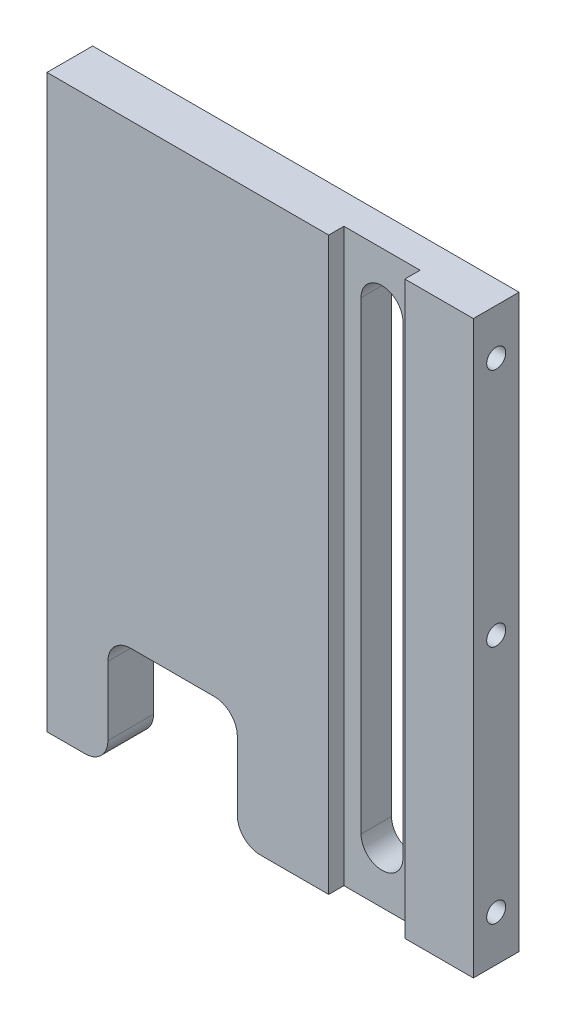
ISO-10303-21;
HEADER;
FILE_DESCRIPTION(('STEP AP214'),'2;1');
FILE_NAME('part.step','',(''),(''),'','','');
FILE_SCHEMA(('AUTOMOTIVE_DESIGN { 1 0 10303 214 1 1 1 1 }'));
ENDSEC;
DATA;
#1=APPLICATION_CONTEXT('core data for automotive mechanical design processes');
#2=APPLICATION_PROTOCOL_DEFINITION('international standard','automotive_design',2000,#1);
#3=PRODUCT_CONTEXT('',#1,'mechanical');
#4=PRODUCT('Part','Part','',(#3));
#5=PRODUCT_RELATED_PRODUCT_CATEGORY('part','',(#4));
#6=PRODUCT_DEFINITION_FORMATION('','',#4);
#7=PRODUCT_DEFINITION_CONTEXT('part definition',#1,'design');
#8=PRODUCT_DEFINITION('design','',#6,#7);
#9=PRODUCT_DEFINITION_SHAPE('','',#8);
#10=(LENGTH_UNIT() NAMED_UNIT(*) SI_UNIT(.MILLI.,.METRE.));
#11=(NAMED_UNIT(*) PLANE_ANGLE_UNIT() SI_UNIT($,.RADIAN.));
#12=(NAMED_UNIT(*) SI_UNIT($,.STERADIAN.) SOLID_ANGLE_UNIT());
#13=UNCERTAINTY_MEASURE_WITH_UNIT(LENGTH_MEASURE(1.E-05),#10,'distance_accuracy_value','');
#14=(GEOMETRIC_REPRESENTATION_CONTEXT(3) GLOBAL_UNCERTAINTY_ASSIGNED_CONTEXT((#13)) GLOBAL_UNIT_ASSIGNED_CONTEXT((#10,
#11,#12)) REPRESENTATION_CONTEXT('',''));
#15=CARTESIAN_POINT('',(0.,0.,0.));
#16=DIRECTION('',(0.,0.,1.));
#17=DIRECTION('',(1.,0.,0.));
#18=AXIS2_PLACEMENT_3D('',#15,#16,#17);
#19=CARTESIAN_POINT('',(-28.,-37.5,6.));
#20=DIRECTION('',(0.,1.,0.));
#21=DIRECTION('',(0.,0.,1.));
#22=AXIS2_PLACEMENT_3D('',#19,#20,#21);
#23=PLANE('',#22);
#24=DIRECTION('',(1.,0.,0.));
#25=VECTOR('',#24,1.);
#26=CARTESIAN_POINT('',(-28.,-37.5,6.));
#27=LINE('',#26,#25);
#28=CARTESIAN_POINT('',(0.,-37.5,6.));
#29=VERTEX_POINT('',#28);
#30=CARTESIAN_POINT('',(9.00000000000001,-37.5,6.));
#31=VERTEX_POINT('',#30);
#32=EDGE_CURVE('E318',#29,#31,#27,.T.);
#33=ORIENTED_EDGE('',*,*,#32,.F.);
#34=DIRECTION('',(0.,0.,1.));
#35=VECTOR('',#34,1.);
#36=CARTESIAN_POINT('',(0.,-37.5,6.));
#37=LINE('',#36,#35);
#38=CARTESIAN_POINT('',(0.,-37.5,0.));
#39=VERTEX_POINT('',#38);
#40=EDGE_CURVE('E363',#29,#39,#37,.F.);
#41=ORIENTED_EDGE('',*,*,#40,.T.);
#42=DIRECTION('',(1.,0.,0.));
#43=VECTOR('',#42,1.);
#44=CARTESIAN_POINT('',(-28.,-37.5,0.));
#45=LINE('',#44,#43);
#46=CARTESIAN_POINT('',(28.,-37.5,0.));
#47=VERTEX_POINT('',#46);
#48=EDGE_CURVE('E325',#39,#47,#45,.T.);
#49=ORIENTED_EDGE('',*,*,#48,.T.);
#50=DIRECTION('',(0.,0.,-1.));
#51=VECTOR('',#50,1.);
#52=CARTESIAN_POINT('',(28.,-37.5,6.));
#53=LINE('',#52,#51);
#54=CARTESIAN_POINT('',(28.,-37.5,6.));
#55=VERTEX_POINT('',#54);
#56=EDGE_CURVE('E317',#55,#47,#53,.T.);
#57=ORIENTED_EDGE('',*,*,#56,.F.);
#58=CARTESIAN_POINT('',(19.,-37.5,6.));
#59=VERTEX_POINT('',#58);
#60=EDGE_CURVE('E313',#59,#55,#27,.T.);
#61=ORIENTED_EDGE('',*,*,#60,.F.);
#62=DIRECTION('',(0.,0.,1.));
#63=VECTOR('',#62,1.);
#64=CARTESIAN_POINT('',(19.,-37.5,4.));
#65=LINE('',#64,#63);
#66=CARTESIAN_POINT('',(19.,-37.5,4.));
#67=VERTEX_POINT('',#66);
#68=EDGE_CURVE('E203',#67,#59,#65,.T.);
#69=ORIENTED_EDGE('',*,*,#68,.F.);
#70=DIRECTION('',(1.,0.,0.));
#71=VECTOR('',#70,1.);
#72=CARTESIAN_POINT('',(19.,-37.5,4.));
#73=LINE('',#72,#71);
#74=CARTESIAN_POINT('',(9.00000000000001,-37.5,4.));
#75=VERTEX_POINT('',#74);
#76=EDGE_CURVE('E211',#75,#67,#73,.T.);
#77=ORIENTED_EDGE('',*,*,#76,.F.);
#78=DIRECTION('',(0.,0.,1.));
#79=VECTOR('',#78,1.);
#80=CARTESIAN_POINT('',(9.00000000000001,-37.5,4.));
#81=LINE('',#80,#79);
#82=EDGE_CURVE('E193',#75,#31,#81,.T.);
#83=ORIENTED_EDGE('',*,*,#82,.T.);
#84=EDGE_LOOP('',(#33,#41,#49,#57,#61,#69,#77,#83));
#85=FACE_BOUND('',#84,.T.);
#86=ADVANCED_FACE('F37',(#85),#23,.F.);
#87=CARTESIAN_POINT('',(0.,0.,6.));
#88=DIRECTION('',(0.,0.,1.));
#89=DIRECTION('',(1.,0.,0.));
#90=AXIS2_PLACEMENT_3D('',#87,#88,#89);
#91=PLANE('',#90);
#92=CARTESIAN_POINT('',(-28.,-37.5,6.));
#93=VERTEX_POINT('',#92);
#94=CARTESIAN_POINT('',(-23.,-37.5,6.));
#95=VERTEX_POINT('',#94);
#96=EDGE_CURVE('E314',#93,#95,#27,.T.);
#97=ORIENTED_EDGE('',*,*,#96,.T.);
#98=CARTESIAN_POINT('',(-23.,-34.5,6.));
#99=DIRECTION('',(0.,0.,1.));
#100=DIRECTION('',(1.,0.,0.));
#101=AXIS2_PLACEMENT_3D('',#98,#99,#100);
#102=CIRCLE('',#101,3.);
#103=CARTESIAN_POINT('',(-20.,-34.5,6.));
#104=VERTEX_POINT('',#103);
#105=EDGE_CURVE('E347',#95,#104,#102,.T.);
#106=ORIENTED_EDGE('',*,*,#105,.T.);
#107=DIRECTION('',(0.,-1.,0.));
#108=VECTOR('',#107,1.);
#109=CARTESIAN_POINT('',(-20.,-22.5,6.));
#110=LINE('',#109,#108);
#111=CARTESIAN_POINT('',(-20.,-25.5,6.));
#112=VERTEX_POINT('',#111);
#113=EDGE_CURVE('E377',#112,#104,#110,.T.);
#114=ORIENTED_EDGE('',*,*,#113,.F.);
#115=CARTESIAN_POINT('',(-17.,-25.5,6.));
#116=DIRECTION('',(0.,0.,1.));
#117=DIRECTION('',(1.,0.,0.));
#118=AXIS2_PLACEMENT_3D('',#115,#116,#117);
#119=CIRCLE('',#118,3.);
#120=CARTESIAN_POINT('',(-17.,-22.5,6.));
#121=VERTEX_POINT('',#120);
#122=EDGE_CURVE('E45',#112,#121,#119,.F.);
#123=ORIENTED_EDGE('',*,*,#122,.T.);
#124=DIRECTION('',(-1.,0.,0.));
#125=VECTOR('',#124,1.);
#126=CARTESIAN_POINT('',(-20.,-22.5,6.));
#127=LINE('',#126,#125);
#128=CARTESIAN_POINT('',(-6.,-22.5,6.));
#129=VERTEX_POINT('',#128);
#130=EDGE_CURVE('E375',#129,#121,#127,.T.);
#131=ORIENTED_EDGE('',*,*,#130,.F.);
#132=CARTESIAN_POINT('',(-6.,-25.5,6.));
#133=DIRECTION('',(0.,0.,1.));
#134=DIRECTION('',(1.,0.,0.));
#135=AXIS2_PLACEMENT_3D('',#132,#133,#134);
#136=CIRCLE('',#135,3.);
#137=CARTESIAN_POINT('',(-3.,-25.5,6.));
#138=VERTEX_POINT('',#137);
#139=EDGE_CURVE('E369',#129,#138,#136,.F.);
#140=ORIENTED_EDGE('',*,*,#139,.T.);
#141=DIRECTION('',(0.,1.,0.));
#142=VECTOR('',#141,1.);
#143=CARTESIAN_POINT('',(-3.,-22.5,6.));
#144=LINE('',#143,#142);
#145=CARTESIAN_POINT('',(-3.,-34.5,6.));
#146=VERTEX_POINT('',#145);
#147=EDGE_CURVE('E382',#146,#138,#144,.T.);
#148=ORIENTED_EDGE('',*,*,#147,.F.);
#149=CARTESIAN_POINT('',(0.,-34.5,6.));
#150=DIRECTION('',(0.,0.,1.));
#151=DIRECTION('',(1.,0.,0.));
#152=AXIS2_PLACEMENT_3D('',#149,#150,#151);
#153=CIRCLE('',#152,3.);
#154=EDGE_CURVE('E345',#146,#29,#153,.T.);
#155=ORIENTED_EDGE('',*,*,#154,.T.);
#156=ORIENTED_EDGE('',*,*,#32,.T.);
#157=DIRECTION('',(0.,-1.,0.));
#158=VECTOR('',#157,1.);
#159=CARTESIAN_POINT('',(9.00000000000001,37.5,6.));
#160=LINE('',#159,#158);
#161=CARTESIAN_POINT('',(9.00000000000001,37.5,6.));
#162=VERTEX_POINT('',#161);
#163=EDGE_CURVE('E199',#162,#31,#160,.T.);
#164=ORIENTED_EDGE('',*,*,#163,.F.);
#165=DIRECTION('',(-1.,0.,0.));
#166=VECTOR('',#165,1.);
#167=CARTESIAN_POINT('',(-28.,37.5,6.));
#168=LINE('',#167,#166);
#169=CARTESIAN_POINT('',(-28.,37.5,6.));
#170=VERTEX_POINT('',#169);
#171=EDGE_CURVE('E306',#162,#170,#168,.T.);
#172=ORIENTED_EDGE('',*,*,#171,.T.);
#173=DIRECTION('',(0.,-1.,0.));
#174=VECTOR('',#173,1.);
#175=CARTESIAN_POINT('',(-28.,37.5,6.));
#176=LINE('',#175,#174);
#177=EDGE_CURVE('E311',#170,#93,#176,.T.);
#178=ORIENTED_EDGE('',*,*,#177,.T.);
#179=EDGE_LOOP('',(#97,#106,#114,#123,#131,#140,#148,#155,#156,#164,#172,#178));
#180=FACE_BOUND('',#179,.T.);
#181=ADVANCED_FACE('F374',(#180),#91,.T.);
#182=CARTESIAN_POINT('',(28.,37.5,6.));
#183=DIRECTION('',(-1.,0.,0.));
#184=DIRECTION('',(0.,0.,1.));
#185=AXIS2_PLACEMENT_3D('',#182,#183,#184);
#186=PLANE('',#185);
#187=CARTESIAN_POINT('',(28.,31.5,2.99999999999999));
#188=DIRECTION('',(1.,0.,0.));
#189=DIRECTION('',(0.,0.,-1.));
#190=AXIS2_PLACEMENT_3D('',#187,#188,#189);
#191=CIRCLE('',#190,1.25);
#192=CARTESIAN_POINT('',(28.,31.5,1.74999999999999));
#193=VERTEX_POINT('',#192);
#194=EDGE_CURVE('E242',#193,#193,#191,.T.);
#195=ORIENTED_EDGE('',*,*,#194,.F.);
#196=EDGE_LOOP('',(#195));
#197=FACE_BOUND('',#196,.T.);
#198=CARTESIAN_POINT('',(28.,0.,3.));
#199=DIRECTION('',(1.,0.,0.));
#200=DIRECTION('',(0.,0.,-1.));
#201=AXIS2_PLACEMENT_3D('',#198,#199,#200);
#202=CIRCLE('',#201,1.25);
#203=CARTESIAN_POINT('',(28.,0.,1.75));
#204=VERTEX_POINT('',#203);
#205=EDGE_CURVE('E248',#204,#204,#202,.T.);
#206=ORIENTED_EDGE('',*,*,#205,.F.);
#207=EDGE_LOOP('',(#206));
#208=FACE_BOUND('',#207,.T.);
#209=CARTESIAN_POINT('',(28.,-31.5,3.));
#210=DIRECTION('',(1.,0.,0.));
#211=DIRECTION('',(0.,0.,-1.));
#212=AXIS2_PLACEMENT_3D('',#209,#210,#211);
#213=CIRCLE('',#212,1.25);
#214=CARTESIAN_POINT('',(28.,-31.5,1.75));
#215=VERTEX_POINT('',#214);
#216=EDGE_CURVE('E254',#215,#215,#213,.T.);
#217=ORIENTED_EDGE('',*,*,#216,.F.);
#218=EDGE_LOOP('',(#217));
#219=FACE_BOUND('',#218,.T.);
#220=DIRECTION('',(0.,1.,0.));
#221=VECTOR('',#220,1.);
#222=CARTESIAN_POINT('',(28.,37.5,0.));
#223=LINE('',#222,#221);
#224=CARTESIAN_POINT('',(28.,37.5,0.));
#225=VERTEX_POINT('',#224);
#226=EDGE_CURVE('E294',#47,#225,#223,.T.);
#227=ORIENTED_EDGE('',*,*,#226,.T.);
#228=DIRECTION('',(0.,0.,-1.));
#229=VECTOR('',#228,1.);
#230=CARTESIAN_POINT('',(28.,37.5,6.));
#231=LINE('',#230,#229);
#232=CARTESIAN_POINT('',(28.,37.5,6.));
#233=VERTEX_POINT('',#232);
#234=EDGE_CURVE('E336',#233,#225,#231,.T.);
#235=ORIENTED_EDGE('',*,*,#234,.F.);
#236=DIRECTION('',(0.,1.,0.));
#237=VECTOR('',#236,1.);
#238=CARTESIAN_POINT('',(28.,37.5,6.));
#239=LINE('',#238,#237);
#240=EDGE_CURVE('E303',#55,#233,#239,.T.);
#241=ORIENTED_EDGE('',*,*,#240,.F.);
#242=ORIENTED_EDGE('',*,*,#56,.T.);
#243=EDGE_LOOP('',(#227,#235,#241,#242));
#244=FACE_BOUND('',#243,.T.);
#245=ADVANCED_FACE('F421',(#197,#208,#219,#244),#186,.F.);
#246=CARTESIAN_POINT('',(-28.,37.5,6.));
#247=DIRECTION('',(0.,-1.,0.));
#248=DIRECTION('',(0.,0.,-1.));
#249=AXIS2_PLACEMENT_3D('',#246,#247,#248);
#250=PLANE('',#249);
#251=ORIENTED_EDGE('',*,*,#171,.F.);
#252=DIRECTION('',(0.,0.,1.));
#253=VECTOR('',#252,1.);
#254=CARTESIAN_POINT('',(9.00000000000001,37.5,4.));
#255=LINE('',#254,#253);
#256=CARTESIAN_POINT('',(9.00000000000001,37.5,4.));
#257=VERTEX_POINT('',#256);
#258=EDGE_CURVE('E227',#257,#162,#255,.T.);
#259=ORIENTED_EDGE('',*,*,#258,.F.);
#260=DIRECTION('',(-1.,0.,0.));
#261=VECTOR('',#260,1.);
#262=CARTESIAN_POINT('',(19.,37.5,4.));
#263=LINE('',#262,#261);
#264=CARTESIAN_POINT('',(19.,37.5,4.));
#265=VERTEX_POINT('',#264);
#266=EDGE_CURVE('E204',#265,#257,#263,.T.);
#267=ORIENTED_EDGE('',*,*,#266,.F.);
#268=DIRECTION('',(0.,0.,1.));
#269=VECTOR('',#268,1.);
#270=CARTESIAN_POINT('',(19.,37.5,4.));
#271=LINE('',#270,#269);
#272=CARTESIAN_POINT('',(19.,37.5,6.));
#273=VERTEX_POINT('',#272);
#274=EDGE_CURVE('E230',#265,#273,#271,.T.);
#275=ORIENTED_EDGE('',*,*,#274,.T.);
#276=EDGE_CURVE('E308',#233,#273,#168,.T.);
#277=ORIENTED_EDGE('',*,*,#276,.F.);
#278=ORIENTED_EDGE('',*,*,#234,.T.);
#279=DIRECTION('',(-1.,0.,0.));
#280=VECTOR('',#279,1.);
#281=CARTESIAN_POINT('',(-28.,37.5,0.));
#282=LINE('',#281,#280);
#283=CARTESIAN_POINT('',(-28.,37.5,0.));
#284=VERTEX_POINT('',#283);
#285=EDGE_CURVE('E321',#225,#284,#282,.T.);
#286=ORIENTED_EDGE('',*,*,#285,.T.);
#287=DIRECTION('',(0.,0.,-1.));
#288=VECTOR('',#287,1.);
#289=CARTESIAN_POINT('',(-28.,37.5,6.));
#290=LINE('',#289,#288);
#291=EDGE_CURVE('E333',#170,#284,#290,.T.);
#292=ORIENTED_EDGE('',*,*,#291,.F.);
#293=EDGE_LOOP('',(#251,#259,#267,#275,#277,#278,#286,#292));
#294=FACE_BOUND('',#293,.T.);
#295=ADVANCED_FACE('F424',(#294),#250,.F.);
#296=CARTESIAN_POINT('',(-28.,37.5,6.));
#297=DIRECTION('',(1.,0.,0.));
#298=DIRECTION('',(0.,1.,0.));
#299=AXIS2_PLACEMENT_3D('',#296,#297,#298);
#300=PLANE('',#299);
#301=CARTESIAN_POINT('',(-28.,31.5,2.99999999999999));
#302=DIRECTION('',(-1.,0.,0.));
#303=DIRECTION('',(0.,0.,1.));
#304=AXIS2_PLACEMENT_3D('',#301,#302,#303);
#305=CIRCLE('',#304,1.25);
#306=CARTESIAN_POINT('',(-28.,31.5,4.24999999999999));
#307=VERTEX_POINT('',#306);
#308=EDGE_CURVE('E260',#307,#307,#305,.T.);
#309=ORIENTED_EDGE('',*,*,#308,.F.);
#310=EDGE_LOOP('',(#309));
#311=FACE_BOUND('',#310,.T.);
#312=CARTESIAN_POINT('',(-28.,0.,3.));
#313=DIRECTION('',(-1.,0.,0.));
#314=DIRECTION('',(0.,0.,1.));
#315=AXIS2_PLACEMENT_3D('',#312,#313,#314);
#316=CIRCLE('',#315,1.25);
#317=CARTESIAN_POINT('',(-28.,0.,4.25));
#318=VERTEX_POINT('',#317);
#319=EDGE_CURVE('E266',#318,#318,#316,.T.);
#320=ORIENTED_EDGE('',*,*,#319,.F.);
#321=EDGE_LOOP('',(#320));
#322=FACE_BOUND('',#321,.T.);
#323=CARTESIAN_POINT('',(-28.,-31.5,3.));
#324=DIRECTION('',(-1.,0.,0.));
#325=DIRECTION('',(0.,0.,1.));
#326=AXIS2_PLACEMENT_3D('',#323,#324,#325);
#327=CIRCLE('',#326,1.25);
#328=CARTESIAN_POINT('',(-28.,-31.5,4.25));
#329=VERTEX_POINT('',#328);
#330=EDGE_CURVE('E272',#329,#329,#327,.T.);
#331=ORIENTED_EDGE('',*,*,#330,.F.);
#332=EDGE_LOOP('',(#331));
#333=FACE_BOUND('',#332,.T.);
#334=DIRECTION('',(0.,-1.,0.));
#335=VECTOR('',#334,1.);
#336=CARTESIAN_POINT('',(-28.,37.5,0.));
#337=LINE('',#336,#335);
#338=CARTESIAN_POINT('',(-28.,-37.5,0.));
#339=VERTEX_POINT('',#338);
#340=EDGE_CURVE('E323',#284,#339,#337,.T.);
#341=ORIENTED_EDGE('',*,*,#340,.T.);
#342=DIRECTION('',(0.,0.,-1.));
#343=VECTOR('',#342,1.);
#344=CARTESIAN_POINT('',(-28.,-37.5,6.));
#345=LINE('',#344,#343);
#346=EDGE_CURVE('E330',#93,#339,#345,.T.);
#347=ORIENTED_EDGE('',*,*,#346,.F.);
#348=ORIENTED_EDGE('',*,*,#177,.F.);
#349=ORIENTED_EDGE('',*,*,#291,.T.);
#350=EDGE_LOOP('',(#341,#347,#348,#349));
#351=FACE_BOUND('',#350,.T.);
#352=ADVANCED_FACE('F447',(#311,#322,#333,#351),#300,.F.);
#353=CARTESIAN_POINT('',(-23.,-37.5,0.));
#354=VERTEX_POINT('',#353);
#355=EDGE_CURVE('E307',#339,#354,#45,.T.);
#356=ORIENTED_EDGE('',*,*,#355,.T.);
#357=DIRECTION('',(0.,0.,1.));
#358=VECTOR('',#357,1.);
#359=CARTESIAN_POINT('',(-23.,-37.5,6.));
#360=LINE('',#359,#358);
#361=EDGE_CURVE('E342',#354,#95,#360,.T.);
#362=ORIENTED_EDGE('',*,*,#361,.T.);
#363=ORIENTED_EDGE('',*,*,#96,.F.);
#364=ORIENTED_EDGE('',*,*,#346,.T.);
#365=EDGE_LOOP('',(#356,#362,#363,#364));
#366=FACE_BOUND('',#365,.T.);
#367=ADVANCED_FACE('F439',(#366),#23,.F.);
#368=DIRECTION('',(0.,1.,0.));
#369=VECTOR('',#368,1.);
#370=CARTESIAN_POINT('',(19.,37.5,6.));
#371=LINE('',#370,#369);
#372=EDGE_CURVE('E215',#59,#273,#371,.T.);
#373=ORIENTED_EDGE('',*,*,#372,.F.);
#374=ORIENTED_EDGE('',*,*,#60,.T.);
#375=ORIENTED_EDGE('',*,*,#240,.T.);
#376=ORIENTED_EDGE('',*,*,#276,.T.);
#377=EDGE_LOOP('',(#373,#374,#375,#376));
#378=FACE_BOUND('',#377,.T.);
#379=ADVANCED_FACE('F416',(#378),#91,.T.);
#380=CARTESIAN_POINT('',(0.,0.,0.));
#381=DIRECTION('',(0.,0.,1.));
#382=DIRECTION('',(1.,0.,0.));
#383=AXIS2_PLACEMENT_3D('',#380,#381,#382);
#384=PLANE('',#383);
#385=DIRECTION('',(0.,-1.,0.));
#386=VECTOR('',#385,1.);
#387=CARTESIAN_POINT('',(-20.,-22.5,0.));
#388=LINE('',#387,#386);
#389=CARTESIAN_POINT('',(-20.,-25.5,0.));
#390=VERTEX_POINT('',#389);
#391=CARTESIAN_POINT('',(-20.,-34.5,0.));
#392=VERTEX_POINT('',#391);
#393=EDGE_CURVE('E225',#390,#392,#388,.T.);
#394=ORIENTED_EDGE('',*,*,#393,.T.);
#395=CARTESIAN_POINT('',(-23.,-34.5,0.));
#396=DIRECTION('',(0.,0.,1.));
#397=DIRECTION('',(1.,0.,0.));
#398=AXIS2_PLACEMENT_3D('',#395,#396,#397);
#399=CIRCLE('',#398,3.);
#400=EDGE_CURVE('E356',#392,#354,#399,.F.);
#401=ORIENTED_EDGE('',*,*,#400,.T.);
#402=ORIENTED_EDGE('',*,*,#355,.F.);
#403=ORIENTED_EDGE('',*,*,#340,.F.);
#404=ORIENTED_EDGE('',*,*,#285,.F.);
#405=ORIENTED_EDGE('',*,*,#226,.F.);
#406=ORIENTED_EDGE('',*,*,#48,.F.);
#407=CARTESIAN_POINT('',(0.,-34.5,0.));
#408=DIRECTION('',(0.,0.,1.));
#409=DIRECTION('',(1.,0.,0.));
#410=AXIS2_PLACEMENT_3D('',#407,#408,#409);
#411=CIRCLE('',#410,3.);
#412=CARTESIAN_POINT('',(-3.,-34.5,0.));
#413=VERTEX_POINT('',#412);
#414=EDGE_CURVE('E354',#39,#413,#411,.F.);
#415=ORIENTED_EDGE('',*,*,#414,.T.);
#416=DIRECTION('',(0.,1.,0.));
#417=VECTOR('',#416,1.);
#418=CARTESIAN_POINT('',(-3.,-22.5,0.));
#419=LINE('',#418,#417);
#420=CARTESIAN_POINT('',(-3.,-25.5,0.));
#421=VERTEX_POINT('',#420);
#422=EDGE_CURVE('E395',#413,#421,#419,.T.);
#423=ORIENTED_EDGE('',*,*,#422,.T.);
#424=CARTESIAN_POINT('',(-6.,-25.5,0.));
#425=DIRECTION('',(0.,0.,1.));
#426=DIRECTION('',(1.,0.,0.));
#427=AXIS2_PLACEMENT_3D('',#424,#425,#426);
#428=CIRCLE('',#427,3.);
#429=CARTESIAN_POINT('',(-6.,-22.5,0.));
#430=VERTEX_POINT('',#429);
#431=EDGE_CURVE('E59',#421,#430,#428,.T.);
#432=ORIENTED_EDGE('',*,*,#431,.T.);
#433=DIRECTION('',(-1.,0.,0.));
#434=VECTOR('',#433,1.);
#435=CARTESIAN_POINT('',(-20.,-22.5,0.));
#436=LINE('',#435,#434);
#437=CARTESIAN_POINT('',(-17.,-22.5,0.));
#438=VERTEX_POINT('',#437);
#439=EDGE_CURVE('E390',#430,#438,#436,.T.);
#440=ORIENTED_EDGE('',*,*,#439,.T.);
#441=CARTESIAN_POINT('',(-17.,-25.5,0.));
#442=DIRECTION('',(0.,0.,1.));
#443=DIRECTION('',(1.,0.,0.));
#444=AXIS2_PLACEMENT_3D('',#441,#442,#443);
#445=CIRCLE('',#444,3.);
#446=EDGE_CURVE('E11',#438,#390,#445,.T.);
#447=ORIENTED_EDGE('',*,*,#446,.T.);
#448=EDGE_LOOP('',(#394,#401,#402,#403,#404,#405,#406,#415,#423,#432,#440,#447));
#449=FACE_BOUND('',#448,.T.);
#450=DIRECTION('',(0.,1.,0.));
#451=VECTOR('',#450,1.);
#452=CARTESIAN_POINT('',(16.75,30.5,0.));
#453=LINE('',#452,#451);
#454=CARTESIAN_POINT('',(16.75,-30.5,0.));
#455=VERTEX_POINT('',#454);
#456=CARTESIAN_POINT('',(16.75,30.5,0.));
#457=VERTEX_POINT('',#456);
#458=EDGE_CURVE('E287',#455,#457,#453,.T.);
#459=ORIENTED_EDGE('',*,*,#458,.T.);
#460=CARTESIAN_POINT('',(14.,30.5,0.));
#461=DIRECTION('',(0.,0.,1.));
#462=DIRECTION('',(1.,0.,0.));
#463=AXIS2_PLACEMENT_3D('',#460,#461,#462);
#464=CIRCLE('',#463,2.75);
#465=CARTESIAN_POINT('',(11.25,30.5,0.));
#466=VERTEX_POINT('',#465);
#467=EDGE_CURVE('E278',#457,#466,#464,.T.);
#468=ORIENTED_EDGE('',*,*,#467,.T.);
#469=DIRECTION('',(0.,-1.,0.));
#470=VECTOR('',#469,1.);
#471=CARTESIAN_POINT('',(11.25,30.5,0.));
#472=LINE('',#471,#470);
#473=CARTESIAN_POINT('',(11.25,-30.5,0.));
#474=VERTEX_POINT('',#473);
#475=EDGE_CURVE('E281',#466,#474,#472,.T.);
#476=ORIENTED_EDGE('',*,*,#475,.T.);
#477=CARTESIAN_POINT('',(14.,-30.5,0.));
#478=DIRECTION('',(0.,0.,1.));
#479=DIRECTION('',(1.,0.,0.));
#480=AXIS2_PLACEMENT_3D('',#477,#478,#479);
#481=CIRCLE('',#480,2.75);
#482=EDGE_CURVE('E284',#474,#455,#481,.T.);
#483=ORIENTED_EDGE('',*,*,#482,.T.);
#484=EDGE_LOOP('',(#459,#468,#476,#483));
#485=FACE_BOUND('',#484,.T.);
#486=ADVANCED_FACE('F387',(#449,#485),#384,.F.);
#487=CARTESIAN_POINT('',(14.,30.5,0.));
#488=DIRECTION('',(0.,0.,1.));
#489=DIRECTION('',(1.,0.,0.));
#490=AXIS2_PLACEMENT_3D('',#487,#488,#489);
#491=CYLINDRICAL_SURFACE('',#490,2.75);
#492=DIRECTION('',(0.,0.,1.));
#493=VECTOR('',#492,1.);
#494=CARTESIAN_POINT('',(16.75,30.5,0.));
#495=LINE('',#494,#493);
#496=CARTESIAN_POINT('',(16.75,30.5,4.));
#497=VERTEX_POINT('',#496);
#498=EDGE_CURVE('E291',#457,#497,#495,.T.);
#499=ORIENTED_EDGE('',*,*,#498,.T.);
#500=CARTESIAN_POINT('',(14.,30.5,4.));
#501=DIRECTION('',(0.,0.,-1.));
#502=DIRECTION('',(-1.,0.,0.));
#503=AXIS2_PLACEMENT_3D('',#500,#501,#502);
#504=CIRCLE('',#503,2.75);
#505=CARTESIAN_POINT('',(11.25,30.5,4.));
#506=VERTEX_POINT('',#505);
#507=EDGE_CURVE('E239',#497,#506,#504,.F.);
#508=ORIENTED_EDGE('',*,*,#507,.T.);
#509=DIRECTION('',(0.,0.,1.));
#510=VECTOR('',#509,1.);
#511=CARTESIAN_POINT('',(11.25,30.5,0.));
#512=LINE('',#511,#510);
#513=EDGE_CURVE('E290',#466,#506,#512,.T.);
#514=ORIENTED_EDGE('',*,*,#513,.F.);
#515=ORIENTED_EDGE('',*,*,#467,.F.);
#516=EDGE_LOOP('',(#499,#508,#514,#515));
#517=FACE_BOUND('',#516,.T.);
#518=ADVANCED_FACE('F522',(#517),#491,.F.);
#519=CARTESIAN_POINT('',(16.75,30.5,0.));
#520=DIRECTION('',(1.,0.,0.));
#521=DIRECTION('',(0.,1.,0.));
#522=AXIS2_PLACEMENT_3D('',#519,#520,#521);
#523=PLANE('',#522);
#524=DIRECTION('',(0.,0.,1.));
#525=VECTOR('',#524,1.);
#526=CARTESIAN_POINT('',(16.75,-30.5,0.));
#527=LINE('',#526,#525);
#528=CARTESIAN_POINT('',(16.75,-30.5,4.));
#529=VERTEX_POINT('',#528);
#530=EDGE_CURVE('E295',#455,#529,#527,.T.);
#531=ORIENTED_EDGE('',*,*,#530,.T.);
#532=DIRECTION('',(0.,1.,0.));
#533=VECTOR('',#532,1.);
#534=CARTESIAN_POINT('',(16.75,30.5,4.));
#535=LINE('',#534,#533);
#536=EDGE_CURVE('E236',#529,#497,#535,.T.);
#537=ORIENTED_EDGE('',*,*,#536,.T.);
#538=ORIENTED_EDGE('',*,*,#498,.F.);
#539=ORIENTED_EDGE('',*,*,#458,.F.);
#540=EDGE_LOOP('',(#531,#537,#538,#539));
#541=FACE_BOUND('',#540,.T.);
#542=ADVANCED_FACE('F583',(#541),#523,.F.);
#543=CARTESIAN_POINT('',(14.,-30.5,0.));
#544=DIRECTION('',(0.,0.,1.));
#545=DIRECTION('',(1.,0.,0.));
#546=AXIS2_PLACEMENT_3D('',#543,#544,#545);
#547=CYLINDRICAL_SURFACE('',#546,2.75);
#548=DIRECTION('',(0.,0.,1.));
#549=VECTOR('',#548,1.);
#550=CARTESIAN_POINT('',(11.25,-30.5,0.));
#551=LINE('',#550,#549);
#552=CARTESIAN_POINT('',(11.25,-30.5,4.));
#553=VERTEX_POINT('',#552);
#554=EDGE_CURVE('E298',#474,#553,#551,.T.);
#555=ORIENTED_EDGE('',*,*,#554,.T.);
#556=CARTESIAN_POINT('',(14.,-30.5,4.));
#557=DIRECTION('',(0.,0.,-1.));
#558=DIRECTION('',(-1.,0.,0.));
#559=AXIS2_PLACEMENT_3D('',#556,#557,#558);
#560=CIRCLE('',#559,2.75);
#561=EDGE_CURVE('E229',#553,#529,#560,.F.);
#562=ORIENTED_EDGE('',*,*,#561,.T.);
#563=ORIENTED_EDGE('',*,*,#530,.F.);
#564=ORIENTED_EDGE('',*,*,#482,.F.);
#565=EDGE_LOOP('',(#555,#562,#563,#564));
#566=FACE_BOUND('',#565,.T.);
#567=ADVANCED_FACE('F571',(#566),#547,.F.);
#568=CARTESIAN_POINT('',(11.25,30.5,0.));
#569=DIRECTION('',(-1.,0.,0.));
#570=DIRECTION('',(0.,-1.,0.));
#571=AXIS2_PLACEMENT_3D('',#568,#569,#570);
#572=PLANE('',#571);
#573=ORIENTED_EDGE('',*,*,#513,.T.);
#574=DIRECTION('',(0.,-1.,0.));
#575=VECTOR('',#574,1.);
#576=CARTESIAN_POINT('',(11.25,30.5,4.));
#577=LINE('',#576,#575);
#578=EDGE_CURVE('E339',#506,#553,#577,.T.);
#579=ORIENTED_EDGE('',*,*,#578,.T.);
#580=ORIENTED_EDGE('',*,*,#554,.F.);
#581=ORIENTED_EDGE('',*,*,#475,.F.);
#582=EDGE_LOOP('',(#573,#579,#580,#581));
#583=FACE_BOUND('',#582,.T.);
#584=ADVANCED_FACE('F565',(#583),#572,.F.);
#585=CARTESIAN_POINT('',(-22.,-31.5,3.));
#586=DIRECTION('',(-1.,0.,0.));
#587=DIRECTION('',(0.,0.,1.));
#588=AXIS2_PLACEMENT_3D('',#585,#586,#587);
#589=CONICAL_SURFACE('',#588,1.25,1.02974425867665);
#590=CARTESIAN_POINT('',(-21.2489242262155,-31.5,3.));
#591=VERTEX_POINT('',#590);
#592=VERTEX_LOOP('',#591);
#593=FACE_BOUND('',#592,.T.);
#594=CARTESIAN_POINT('',(-22.,-31.5,3.));
#595=DIRECTION('',(-1.,0.,0.));
#596=DIRECTION('',(0.,0.,1.));
#597=AXIS2_PLACEMENT_3D('',#594,#595,#596);
#598=CIRCLE('',#597,1.25);
#599=CARTESIAN_POINT('',(-22.,-31.5,4.25));
#600=VERTEX_POINT('',#599);
#601=EDGE_CURVE('E275',#600,#600,#598,.T.);
#602=ORIENTED_EDGE('',*,*,#601,.T.);
#603=EDGE_LOOP('',(#602));
#604=FACE_BOUND('',#603,.T.);
#605=ADVANCED_FACE('F570',(#593,#604),#589,.F.);
#606=CARTESIAN_POINT('',(-28.,-31.5,3.));
#607=DIRECTION('',(-1.,0.,0.));
#608=DIRECTION('',(0.,0.,1.));
#609=AXIS2_PLACEMENT_3D('',#606,#607,#608);
#610=CYLINDRICAL_SURFACE('',#609,1.25);
#611=ORIENTED_EDGE('',*,*,#601,.F.);
#612=EDGE_LOOP('',(#611));
#613=FACE_BOUND('',#612,.T.);
#614=ORIENTED_EDGE('',*,*,#330,.T.);
#615=EDGE_LOOP('',(#614));
#616=FACE_BOUND('',#615,.T.);
#617=ADVANCED_FACE('F722',(#613,#616),#610,.F.);
#618=CARTESIAN_POINT('',(-22.,0.,3.));
#619=DIRECTION('',(-1.,0.,0.));
#620=DIRECTION('',(0.,0.,1.));
#621=AXIS2_PLACEMENT_3D('',#618,#619,#620);
#622=CONICAL_SURFACE('',#621,1.25,1.02974425867665);
#623=CARTESIAN_POINT('',(-21.2489242262156,0.,3.));
#624=VERTEX_POINT('',#623);
#625=VERTEX_LOOP('',#624);
#626=FACE_BOUND('',#625,.T.);
#627=CARTESIAN_POINT('',(-22.,0.,3.));
#628=DIRECTION('',(-1.,0.,0.));
#629=DIRECTION('',(0.,0.,1.));
#630=AXIS2_PLACEMENT_3D('',#627,#628,#629);
#631=CIRCLE('',#630,1.25);
#632=CARTESIAN_POINT('',(-22.,0.,4.25));
#633=VERTEX_POINT('',#632);
#634=EDGE_CURVE('E269',#633,#633,#631,.T.);
#635=ORIENTED_EDGE('',*,*,#634,.T.);
#636=EDGE_LOOP('',(#635));
#637=FACE_BOUND('',#636,.T.);
#638=ADVANCED_FACE('F712',(#626,#637),#622,.F.);
#639=CARTESIAN_POINT('',(-28.,0.,3.));
#640=DIRECTION('',(-1.,0.,0.));
#641=DIRECTION('',(0.,0.,1.));
#642=AXIS2_PLACEMENT_3D('',#639,#640,#641);
#643=CYLINDRICAL_SURFACE('',#642,1.25);
#644=ORIENTED_EDGE('',*,*,#634,.F.);
#645=EDGE_LOOP('',(#644));
#646=FACE_BOUND('',#645,.T.);
#647=ORIENTED_EDGE('',*,*,#319,.T.);
#648=EDGE_LOOP('',(#647));
#649=FACE_BOUND('',#648,.T.);
#650=ADVANCED_FACE('F702',(#646,#649),#643,.F.);
#651=CARTESIAN_POINT('',(-22.,31.5,2.99999999999999));
#652=DIRECTION('',(-1.,0.,0.));
#653=DIRECTION('',(0.,0.,1.));
#654=AXIS2_PLACEMENT_3D('',#651,#652,#653);
#655=CONICAL_SURFACE('',#654,1.25,1.02974425867666);
#656=CARTESIAN_POINT('',(-21.2489242262156,31.5,2.99999999999999));
#657=VERTEX_POINT('',#656);
#658=VERTEX_LOOP('',#657);
#659=FACE_BOUND('',#658,.T.);
#660=CARTESIAN_POINT('',(-22.,31.5,2.99999999999999));
#661=DIRECTION('',(-1.,0.,0.));
#662=DIRECTION('',(0.,0.,1.));
#663=AXIS2_PLACEMENT_3D('',#660,#661,#662);
#664=CIRCLE('',#663,1.25);
#665=CARTESIAN_POINT('',(-22.,31.5,4.24999999999999));
#666=VERTEX_POINT('',#665);
#667=EDGE_CURVE('E263',#666,#666,#664,.T.);
#668=ORIENTED_EDGE('',*,*,#667,.T.);
#669=EDGE_LOOP('',(#668));
#670=FACE_BOUND('',#669,.T.);
#671=ADVANCED_FACE('F691',(#659,#670),#655,.F.);
#672=CARTESIAN_POINT('',(-28.,31.5,2.99999999999999));
#673=DIRECTION('',(-1.,0.,0.));
#674=DIRECTION('',(0.,0.,1.));
#675=AXIS2_PLACEMENT_3D('',#672,#673,#674);
#676=CYLINDRICAL_SURFACE('',#675,1.25);
#677=ORIENTED_EDGE('',*,*,#667,.F.);
#678=EDGE_LOOP('',(#677));
#679=FACE_BOUND('',#678,.T.);
#680=ORIENTED_EDGE('',*,*,#308,.T.);
#681=EDGE_LOOP('',(#680));
#682=FACE_BOUND('',#681,.T.);
#683=ADVANCED_FACE('F674',(#679,#682),#676,.F.);
#684=CARTESIAN_POINT('',(22.,-31.5,3.));
#685=DIRECTION('',(1.,0.,0.));
#686=DIRECTION('',(0.,0.,-1.));
#687=AXIS2_PLACEMENT_3D('',#684,#685,#686);
#688=CONICAL_SURFACE('',#687,1.25,1.02974425867665);
#689=CARTESIAN_POINT('',(21.2489242262156,-31.5,3.));
#690=VERTEX_POINT('',#689);
#691=VERTEX_LOOP('',#690);
#692=FACE_BOUND('',#691,.T.);
#693=CARTESIAN_POINT('',(22.,-31.5,3.));
#694=DIRECTION('',(1.,0.,0.));
#695=DIRECTION('',(0.,0.,-1.));
#696=AXIS2_PLACEMENT_3D('',#693,#694,#695);
#697=CIRCLE('',#696,1.25);
#698=CARTESIAN_POINT('',(22.,-31.5,1.75));
#699=VERTEX_POINT('',#698);
#700=EDGE_CURVE('E257',#699,#699,#697,.T.);
#701=ORIENTED_EDGE('',*,*,#700,.T.);
#702=EDGE_LOOP('',(#701));
#703=FACE_BOUND('',#702,.T.);
#704=ADVANCED_FACE('F664',(#692,#703),#688,.F.);
#705=CARTESIAN_POINT('',(28.,-31.5,3.));
#706=DIRECTION('',(1.,0.,0.));
#707=DIRECTION('',(0.,0.,-1.));
#708=AXIS2_PLACEMENT_3D('',#705,#706,#707);
#709=CYLINDRICAL_SURFACE('',#708,1.25);
#710=ORIENTED_EDGE('',*,*,#700,.F.);
#711=EDGE_LOOP('',(#710));
#712=FACE_BOUND('',#711,.T.);
#713=ORIENTED_EDGE('',*,*,#216,.T.);
#714=EDGE_LOOP('',(#713));
#715=FACE_BOUND('',#714,.T.);
#716=ADVANCED_FACE('F654',(#712,#715),#709,.F.);
#717=CARTESIAN_POINT('',(22.,0.,3.));
#718=DIRECTION('',(1.,0.,0.));
#719=DIRECTION('',(0.,0.,-1.));
#720=AXIS2_PLACEMENT_3D('',#717,#718,#719);
#721=CONICAL_SURFACE('',#720,1.25,1.02974425867665);
#722=CARTESIAN_POINT('',(21.2489242262156,0.,3.));
#723=VERTEX_POINT('',#722);
#724=VERTEX_LOOP('',#723);
#725=FACE_BOUND('',#724,.T.);
#726=CARTESIAN_POINT('',(22.,0.,3.));
#727=DIRECTION('',(1.,0.,0.));
#728=DIRECTION('',(0.,0.,-1.));
#729=AXIS2_PLACEMENT_3D('',#726,#727,#728);
#730=CIRCLE('',#729,1.25);
#731=CARTESIAN_POINT('',(22.,0.,1.75));
#732=VERTEX_POINT('',#731);
#733=EDGE_CURVE('E251',#732,#732,#730,.T.);
#734=ORIENTED_EDGE('',*,*,#733,.T.);
#735=EDGE_LOOP('',(#734));
#736=FACE_BOUND('',#735,.T.);
#737=ADVANCED_FACE('F643',(#725,#736),#721,.F.);
#738=CARTESIAN_POINT('',(28.,0.,3.));
#739=DIRECTION('',(1.,0.,0.));
#740=DIRECTION('',(0.,0.,-1.));
#741=AXIS2_PLACEMENT_3D('',#738,#739,#740);
#742=CYLINDRICAL_SURFACE('',#741,1.25);
#743=ORIENTED_EDGE('',*,*,#733,.F.);
#744=EDGE_LOOP('',(#743));
#745=FACE_BOUND('',#744,.T.);
#746=ORIENTED_EDGE('',*,*,#205,.T.);
#747=EDGE_LOOP('',(#746));
#748=FACE_BOUND('',#747,.T.);
#749=ADVANCED_FACE('F633',(#745,#748),#742,.F.);
#750=CARTESIAN_POINT('',(22.,31.5,2.99999999999999));
#751=DIRECTION('',(1.,0.,0.));
#752=DIRECTION('',(0.,0.,-1.));
#753=AXIS2_PLACEMENT_3D('',#750,#751,#752);
#754=CONICAL_SURFACE('',#753,1.25,1.02974425867666);
#755=CARTESIAN_POINT('',(21.2489242262155,31.5,2.99999999999999));
#756=VERTEX_POINT('',#755);
#757=VERTEX_LOOP('',#756);
#758=FACE_BOUND('',#757,.T.);
#759=CARTESIAN_POINT('',(22.,31.5,2.99999999999999));
#760=DIRECTION('',(1.,0.,0.));
#761=DIRECTION('',(0.,0.,-1.));
#762=AXIS2_PLACEMENT_3D('',#759,#760,#761);
#763=CIRCLE('',#762,1.25);
#764=CARTESIAN_POINT('',(22.,31.5,1.74999999999999));
#765=VERTEX_POINT('',#764);
#766=EDGE_CURVE('E245',#765,#765,#763,.T.);
#767=ORIENTED_EDGE('',*,*,#766,.T.);
#768=EDGE_LOOP('',(#767));
#769=FACE_BOUND('',#768,.T.);
#770=ADVANCED_FACE('F621',(#758,#769),#754,.F.);
#771=CARTESIAN_POINT('',(28.,31.5,2.99999999999999));
#772=DIRECTION('',(1.,0.,0.));
#773=DIRECTION('',(0.,0.,-1.));
#774=AXIS2_PLACEMENT_3D('',#771,#772,#773);
#775=CYLINDRICAL_SURFACE('',#774,1.25);
#776=ORIENTED_EDGE('',*,*,#766,.F.);
#777=EDGE_LOOP('',(#776));
#778=FACE_BOUND('',#777,.T.);
#779=ORIENTED_EDGE('',*,*,#194,.T.);
#780=EDGE_LOOP('',(#779));
#781=FACE_BOUND('',#780,.T.);
#782=ADVANCED_FACE('F560',(#778,#781),#775,.F.);
#783=CARTESIAN_POINT('',(0.,0.,4.));
#784=DIRECTION('',(0.,0.,-1.));
#785=DIRECTION('',(-1.,0.,0.));
#786=AXIS2_PLACEMENT_3D('',#783,#784,#785);
#787=PLANE('',#786);
#788=DIRECTION('',(0.,-1.,0.));
#789=VECTOR('',#788,1.);
#790=CARTESIAN_POINT('',(9.00000000000001,37.5,4.));
#791=LINE('',#790,#789);
#792=EDGE_CURVE('E196',#257,#75,#791,.T.);
#793=ORIENTED_EDGE('',*,*,#792,.T.);
#794=ORIENTED_EDGE('',*,*,#76,.T.);
#795=DIRECTION('',(0.,1.,0.));
#796=VECTOR('',#795,1.);
#797=CARTESIAN_POINT('',(19.,37.5,4.));
#798=LINE('',#797,#796);
#799=EDGE_CURVE('E218',#67,#265,#798,.T.);
#800=ORIENTED_EDGE('',*,*,#799,.T.);
#801=ORIENTED_EDGE('',*,*,#266,.T.);
#802=EDGE_LOOP('',(#793,#794,#800,#801));
#803=FACE_BOUND('',#802,.T.);
#804=ORIENTED_EDGE('',*,*,#536,.F.);
#805=ORIENTED_EDGE('',*,*,#561,.F.);
#806=ORIENTED_EDGE('',*,*,#578,.F.);
#807=ORIENTED_EDGE('',*,*,#507,.F.);
#808=EDGE_LOOP('',(#804,#805,#806,#807));
#809=FACE_BOUND('',#808,.T.);
#810=ADVANCED_FACE('F208',(#803,#809),#787,.F.);
#811=CARTESIAN_POINT('',(9.00000000000001,37.5,4.));
#812=DIRECTION('',(-1.,0.,0.));
#813=DIRECTION('',(0.,0.,1.));
#814=AXIS2_PLACEMENT_3D('',#811,#812,#813);
#815=PLANE('',#814);
#816=ORIENTED_EDGE('',*,*,#163,.T.);
#817=ORIENTED_EDGE('',*,*,#82,.F.);
#818=ORIENTED_EDGE('',*,*,#792,.F.);
#819=ORIENTED_EDGE('',*,*,#258,.T.);
#820=EDGE_LOOP('',(#816,#817,#818,#819));
#821=FACE_BOUND('',#820,.T.);
#822=ADVANCED_FACE('F195',(#821),#815,.F.);
#823=CARTESIAN_POINT('',(19.,37.5,4.));
#824=DIRECTION('',(1.,0.,0.));
#825=DIRECTION('',(0.,0.,-1.));
#826=AXIS2_PLACEMENT_3D('',#823,#824,#825);
#827=PLANE('',#826);
#828=ORIENTED_EDGE('',*,*,#372,.T.);
#829=ORIENTED_EDGE('',*,*,#274,.F.);
#830=ORIENTED_EDGE('',*,*,#799,.F.);
#831=ORIENTED_EDGE('',*,*,#68,.T.);
#832=EDGE_LOOP('',(#828,#829,#830,#831));
#833=FACE_BOUND('',#832,.T.);
#834=ADVANCED_FACE('F427',(#833),#827,.F.);
#835=CARTESIAN_POINT('',(-3.,-22.5,0.));
#836=DIRECTION('',(1.,0.,0.));
#837=DIRECTION('',(0.,1.,0.));
#838=AXIS2_PLACEMENT_3D('',#835,#836,#837);
#839=PLANE('',#838);
#840=ORIENTED_EDGE('',*,*,#422,.F.);
#841=DIRECTION('',(0.,0.,1.));
#842=VECTOR('',#841,1.);
#843=CARTESIAN_POINT('',(-3.,-34.5,0.));
#844=LINE('',#843,#842);
#845=EDGE_CURVE('E360',#413,#146,#844,.T.);
#846=ORIENTED_EDGE('',*,*,#845,.T.);
#847=ORIENTED_EDGE('',*,*,#147,.T.);
#848=DIRECTION('',(0.,0.,1.));
#849=VECTOR('',#848,1.);
#850=CARTESIAN_POINT('',(-3.,-25.5,0.));
#851=LINE('',#850,#849);
#852=EDGE_CURVE('E358',#138,#421,#851,.F.);
#853=ORIENTED_EDGE('',*,*,#852,.T.);
#854=EDGE_LOOP('',(#840,#846,#847,#853));
#855=FACE_BOUND('',#854,.T.);
#856=ADVANCED_FACE('F409',(#855),#839,.F.);
#857=CARTESIAN_POINT('',(-20.,-22.5,0.));
#858=DIRECTION('',(-1.,0.,0.));
#859=DIRECTION('',(0.,0.,1.));
#860=AXIS2_PLACEMENT_3D('',#857,#858,#859);
#861=PLANE('',#860);
#862=ORIENTED_EDGE('',*,*,#113,.T.);
#863=DIRECTION('',(0.,0.,1.));
#864=VECTOR('',#863,1.);
#865=CARTESIAN_POINT('',(-20.,-34.5,0.));
#866=LINE('',#865,#864);
#867=EDGE_CURVE('E352',#104,#392,#866,.F.);
#868=ORIENTED_EDGE('',*,*,#867,.T.);
#869=ORIENTED_EDGE('',*,*,#393,.F.);
#870=DIRECTION('',(0.,0.,1.));
#871=VECTOR('',#870,1.);
#872=CARTESIAN_POINT('',(-20.,-25.5,6.));
#873=LINE('',#872,#871);
#874=EDGE_CURVE('E349',#390,#112,#873,.T.);
#875=ORIENTED_EDGE('',*,*,#874,.T.);
#876=EDGE_LOOP('',(#862,#868,#869,#875));
#877=FACE_BOUND('',#876,.T.);
#878=ADVANCED_FACE('F392',(#877),#861,.F.);
#879=CARTESIAN_POINT('',(-20.,-22.5,0.));
#880=DIRECTION('',(0.,1.,0.));
#881=DIRECTION('',(0.,0.,1.));
#882=AXIS2_PLACEMENT_3D('',#879,#880,#881);
#883=PLANE('',#882);
#884=ORIENTED_EDGE('',*,*,#439,.F.);
#885=DIRECTION('',(0.,0.,1.));
#886=VECTOR('',#885,1.);
#887=CARTESIAN_POINT('',(-6.,-22.5,6.));
#888=LINE('',#887,#886);
#889=EDGE_CURVE('E366',#430,#129,#888,.T.);
#890=ORIENTED_EDGE('',*,*,#889,.T.);
#891=ORIENTED_EDGE('',*,*,#130,.T.);
#892=DIRECTION('',(0.,0.,1.));
#893=VECTOR('',#892,1.);
#894=CARTESIAN_POINT('',(-17.,-22.5,0.));
#895=LINE('',#894,#893);
#896=EDGE_CURVE('E52',#121,#438,#895,.F.);
#897=ORIENTED_EDGE('',*,*,#896,.T.);
#898=EDGE_LOOP('',(#884,#890,#891,#897));
#899=FACE_BOUND('',#898,.T.);
#900=ADVANCED_FACE('F380',(#899),#883,.F.);
#901=CARTESIAN_POINT('',(-23.,-34.5,6.));
#902=DIRECTION('',(0.,0.,1.));
#903=DIRECTION('',(1.,0.,0.));
#904=AXIS2_PLACEMENT_3D('',#901,#902,#903);
#905=CYLINDRICAL_SURFACE('',#904,3.);
#906=ORIENTED_EDGE('',*,*,#400,.F.);
#907=ORIENTED_EDGE('',*,*,#867,.F.);
#908=ORIENTED_EDGE('',*,*,#105,.F.);
#909=ORIENTED_EDGE('',*,*,#361,.F.);
#910=EDGE_LOOP('',(#906,#907,#908,#909));
#911=FACE_BOUND('',#910,.T.);
#912=ADVANCED_FACE('F460',(#911),#905,.T.);
#913=CARTESIAN_POINT('',(0.,-34.5,0.));
#914=DIRECTION('',(0.,0.,1.));
#915=DIRECTION('',(1.,0.,0.));
#916=AXIS2_PLACEMENT_3D('',#913,#914,#915);
#917=CYLINDRICAL_SURFACE('',#916,3.);
#918=ORIENTED_EDGE('',*,*,#414,.F.);
#919=ORIENTED_EDGE('',*,*,#40,.F.);
#920=ORIENTED_EDGE('',*,*,#154,.F.);
#921=ORIENTED_EDGE('',*,*,#845,.F.);
#922=EDGE_LOOP('',(#918,#919,#920,#921));
#923=FACE_BOUND('',#922,.T.);
#924=ADVANCED_FACE('F411',(#923),#917,.T.);
#925=CARTESIAN_POINT('',(-6.,-25.5,0.));
#926=DIRECTION('',(0.,0.,-1.));
#927=DIRECTION('',(-1.,0.,0.));
#928=AXIS2_PLACEMENT_3D('',#925,#926,#927);
#929=CYLINDRICAL_SURFACE('',#928,3.);
#930=ORIENTED_EDGE('',*,*,#431,.F.);
#931=ORIENTED_EDGE('',*,*,#852,.F.);
#932=ORIENTED_EDGE('',*,*,#139,.F.);
#933=ORIENTED_EDGE('',*,*,#889,.F.);
#934=EDGE_LOOP('',(#930,#931,#932,#933));
#935=FACE_BOUND('',#934,.T.);
#936=ADVANCED_FACE('F407',(#935),#929,.F.);
#937=CARTESIAN_POINT('',(-17.,-25.5,0.));
#938=DIRECTION('',(0.,0.,-1.));
#939=DIRECTION('',(-1.,0.,0.));
#940=AXIS2_PLACEMENT_3D('',#937,#938,#939);
#941=CYLINDRICAL_SURFACE('',#940,3.);
#942=ORIENTED_EDGE('',*,*,#446,.F.);
#943=ORIENTED_EDGE('',*,*,#896,.F.);
#944=ORIENTED_EDGE('',*,*,#122,.F.);
#945=ORIENTED_EDGE('',*,*,#874,.F.);
#946=EDGE_LOOP('',(#942,#943,#944,#945));
#947=FACE_BOUND('',#946,.T.);
#948=ADVANCED_FACE('F39',(#947),#941,.F.);
#949=CLOSED_SHELL('',(#86,#181,#245,#295,#352,#367,#379,#486,#518,#542,#567,#584,#605,#617,#638,
#650,#671,#683,#704,#716,#737,#749,#770,#782,#810,#822,#834,#856,#878,#900,#912,#924,#936,#948));
#950=MANIFOLD_SOLID_BREP('B2',#949);
#951=ADVANCED_BREP_SHAPE_REPRESENTATION('',(#18,#950),#14);
#952=SHAPE_DEFINITION_REPRESENTATION(#9,#951);
ENDSEC;
END-ISO-10303-21;
